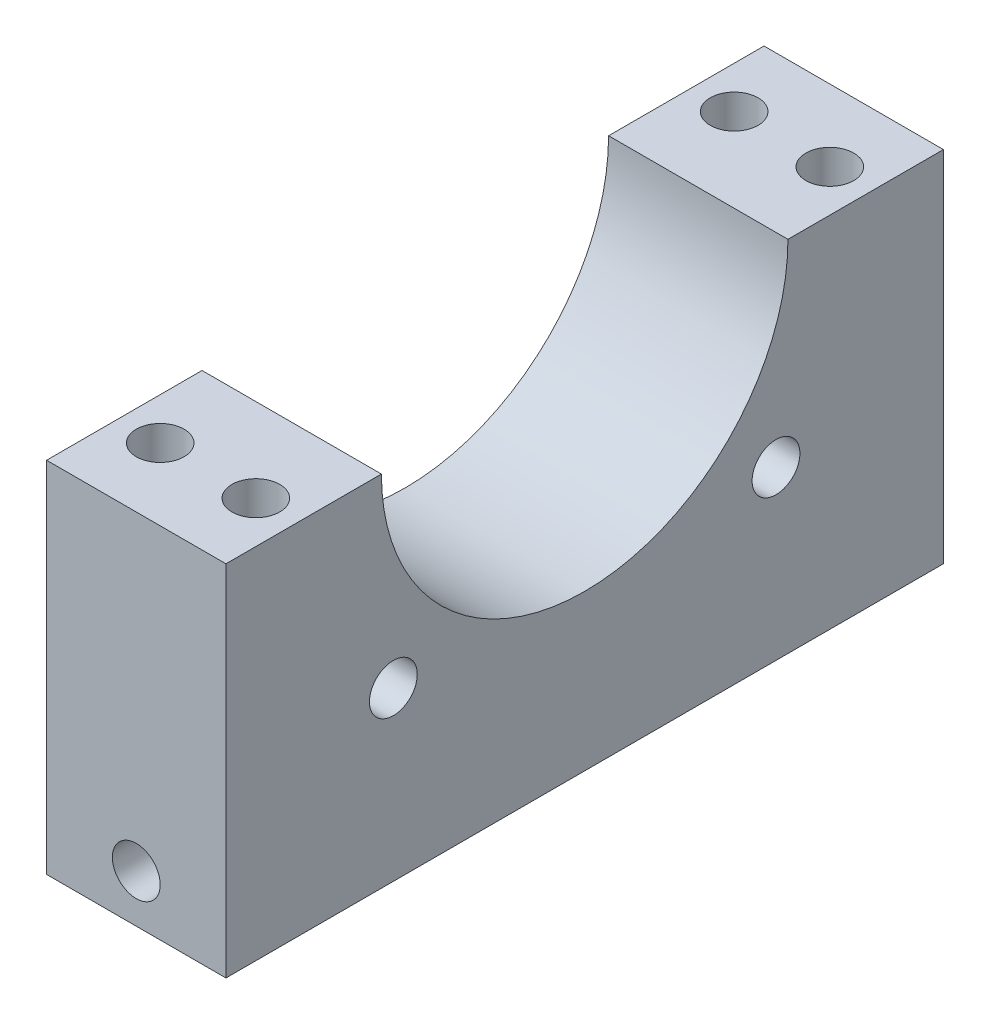
ISO-10303-21;
HEADER;
FILE_DESCRIPTION(('STEP AP214'),'2;1');
FILE_NAME('part.step','',(''),(''),'','','');
FILE_SCHEMA(('AUTOMOTIVE_DESIGN { 1 0 10303 214 1 1 1 1 }'));
ENDSEC;
DATA;
#1=APPLICATION_CONTEXT('core data for automotive mechanical design processes');
#2=APPLICATION_PROTOCOL_DEFINITION('international standard','automotive_design',2000,#1);
#3=PRODUCT_CONTEXT('',#1,'mechanical');
#4=PRODUCT('Part','Part','',(#3));
#5=PRODUCT_RELATED_PRODUCT_CATEGORY('part','',(#4));
#6=PRODUCT_DEFINITION_FORMATION('','',#4);
#7=PRODUCT_DEFINITION_CONTEXT('part definition',#1,'design');
#8=PRODUCT_DEFINITION('design','',#6,#7);
#9=PRODUCT_DEFINITION_SHAPE('','',#8);
#10=(LENGTH_UNIT() NAMED_UNIT(*) SI_UNIT(.MILLI.,.METRE.));
#11=(NAMED_UNIT(*) PLANE_ANGLE_UNIT() SI_UNIT($,.RADIAN.));
#12=(NAMED_UNIT(*) SI_UNIT($,.STERADIAN.) SOLID_ANGLE_UNIT());
#13=UNCERTAINTY_MEASURE_WITH_UNIT(LENGTH_MEASURE(1.E-05),#10,'distance_accuracy_value','');
#14=(GEOMETRIC_REPRESENTATION_CONTEXT(3) GLOBAL_UNCERTAINTY_ASSIGNED_CONTEXT((#13)) GLOBAL_UNIT_ASSIGNED_CONTEXT((#10,
#11,#12)) REPRESENTATION_CONTEXT('',''));
#15=CARTESIAN_POINT('',(0.,0.,0.));
#16=DIRECTION('',(0.,0.,1.));
#17=DIRECTION('',(1.,0.,0.));
#18=AXIS2_PLACEMENT_3D('',#15,#16,#17);
#19=CARTESIAN_POINT('',(-7.5,70.,30.));
#20=DIRECTION('',(1.,0.,0.));
#21=DIRECTION('',(0.,0.,-1.));
#22=AXIS2_PLACEMENT_3D('',#19,#20,#21);
#23=PLANE('',#22);
#24=DIRECTION('',(0.,-1.,0.));
#25=VECTOR('',#24,1.);
#26=CARTESIAN_POINT('',(-7.5,70.,30.));
#27=LINE('',#26,#25);
#28=CARTESIAN_POINT('',(-7.5,30.,30.));
#29=VERTEX_POINT('',#28);
#30=CARTESIAN_POINT('',(-7.5,0.,30.));
#31=VERTEX_POINT('',#30);
#32=EDGE_CURVE('E113',#29,#31,#27,.T.);
#33=ORIENTED_EDGE('',*,*,#32,.F.);
#34=DIRECTION('',(0.,0.,-1.));
#35=VECTOR('',#34,1.);
#36=CARTESIAN_POINT('',(-7.5,30.,30.));
#37=LINE('',#36,#35);
#38=CARTESIAN_POINT('',(-7.5,30.,17.));
#39=VERTEX_POINT('',#38);
#40=EDGE_CURVE('E91',#29,#39,#37,.T.);
#41=ORIENTED_EDGE('',*,*,#40,.T.);
#42=CARTESIAN_POINT('',(-7.5,30.,0.));
#43=DIRECTION('',(1.,0.,0.));
#44=DIRECTION('',(0.,0.,-1.));
#45=AXIS2_PLACEMENT_3D('',#42,#43,#44);
#46=CIRCLE('',#45,17.);
#47=CARTESIAN_POINT('',(-7.5,30.,-17.));
#48=VERTEX_POINT('',#47);
#49=EDGE_CURVE('E124',#39,#48,#46,.T.);
#50=ORIENTED_EDGE('',*,*,#49,.T.);
#51=CARTESIAN_POINT('',(-7.5,30.,-30.));
#52=VERTEX_POINT('',#51);
#53=EDGE_CURVE('E53',#48,#52,#37,.T.);
#54=ORIENTED_EDGE('',*,*,#53,.T.);
#55=DIRECTION('',(0.,-1.,0.));
#56=VECTOR('',#55,1.);
#57=CARTESIAN_POINT('',(-7.5,70.,-30.));
#58=LINE('',#57,#56);
#59=CARTESIAN_POINT('',(-7.5,0.,-30.));
#60=VERTEX_POINT('',#59);
#61=EDGE_CURVE('E117',#52,#60,#58,.T.);
#62=ORIENTED_EDGE('',*,*,#61,.T.);
#63=DIRECTION('',(0.,0.,1.));
#64=VECTOR('',#63,1.);
#65=CARTESIAN_POINT('',(-7.5,0.,30.));
#66=LINE('',#65,#64);
#67=EDGE_CURVE('E133',#60,#31,#66,.T.);
#68=ORIENTED_EDGE('',*,*,#67,.T.);
#69=EDGE_LOOP('',(#33,#41,#50,#54,#62,#68));
#70=FACE_BOUND('',#69,.T.);
#71=ADVANCED_FACE('F39',(#70),#23,.F.);
#72=CARTESIAN_POINT('',(7.5,70.,30.));
#73=DIRECTION('',(0.,0.,-1.));
#74=DIRECTION('',(-1.,0.,0.));
#75=AXIS2_PLACEMENT_3D('',#72,#73,#74);
#76=PLANE('',#75);
#77=CARTESIAN_POINT('',(4.44089209850063E-13,4.00000000003941,30.));
#78=DIRECTION('',(0.,0.,1.));
#79=DIRECTION('',(1.,0.,0.));
#80=AXIS2_PLACEMENT_3D('',#77,#78,#79);
#81=CIRCLE('',#80,2.);
#82=CARTESIAN_POINT('',(2.00000000000044,4.00000000003941,30.));
#83=VERTEX_POINT('',#82);
#84=EDGE_CURVE('E191',#83,#83,#81,.T.);
#85=ORIENTED_EDGE('',*,*,#84,.F.);
#86=EDGE_LOOP('',(#85));
#87=FACE_BOUND('',#86,.T.);
#88=DIRECTION('',(0.,-1.,0.));
#89=VECTOR('',#88,1.);
#90=CARTESIAN_POINT('',(7.5,70.,30.));
#91=LINE('',#90,#89);
#92=CARTESIAN_POINT('',(7.5,30.,30.));
#93=VERTEX_POINT('',#92);
#94=CARTESIAN_POINT('',(7.5,0.,30.));
#95=VERTEX_POINT('',#94);
#96=EDGE_CURVE('E102',#93,#95,#91,.T.);
#97=ORIENTED_EDGE('',*,*,#96,.F.);
#98=DIRECTION('',(1.,0.,0.));
#99=VECTOR('',#98,1.);
#100=CARTESIAN_POINT('',(-21.5,30.,30.));
#101=LINE('',#100,#99);
#102=EDGE_CURVE('E88',#29,#93,#101,.T.);
#103=ORIENTED_EDGE('',*,*,#102,.F.);
#104=ORIENTED_EDGE('',*,*,#32,.T.);
#105=DIRECTION('',(1.,0.,0.));
#106=VECTOR('',#105,1.);
#107=CARTESIAN_POINT('',(7.5,0.,30.));
#108=LINE('',#107,#106);
#109=EDGE_CURVE('E111',#31,#95,#108,.T.);
#110=ORIENTED_EDGE('',*,*,#109,.T.);
#111=EDGE_LOOP('',(#97,#103,#104,#110));
#112=FACE_BOUND('',#111,.T.);
#113=ADVANCED_FACE('F109',(#87,#112),#76,.F.);
#114=CARTESIAN_POINT('',(7.5,70.,30.));
#115=DIRECTION('',(-1.,0.,0.));
#116=DIRECTION('',(0.,0.,1.));
#117=AXIS2_PLACEMENT_3D('',#114,#115,#116);
#118=PLANE('',#117);
#119=CARTESIAN_POINT('',(7.5,14.,16.));
#120=DIRECTION('',(1.,0.,0.));
#121=DIRECTION('',(0.,0.,-1.));
#122=AXIS2_PLACEMENT_3D('',#119,#120,#121);
#123=CIRCLE('',#122,2.);
#124=CARTESIAN_POINT('',(7.5,14.,14.));
#125=VERTEX_POINT('',#124);
#126=EDGE_CURVE('E180',#125,#125,#123,.T.);
#127=ORIENTED_EDGE('',*,*,#126,.F.);
#128=EDGE_LOOP('',(#127));
#129=FACE_BOUND('',#128,.T.);
#130=CARTESIAN_POINT('',(7.5,14.,-16.));
#131=DIRECTION('',(1.,0.,0.));
#132=DIRECTION('',(0.,0.,-1.));
#133=AXIS2_PLACEMENT_3D('',#130,#131,#132);
#134=CIRCLE('',#133,2.);
#135=CARTESIAN_POINT('',(7.5,14.,-18.));
#136=VERTEX_POINT('',#135);
#137=EDGE_CURVE('E176',#136,#136,#134,.T.);
#138=ORIENTED_EDGE('',*,*,#137,.F.);
#139=EDGE_LOOP('',(#138));
#140=FACE_BOUND('',#139,.T.);
#141=DIRECTION('',(0.,-1.,0.));
#142=VECTOR('',#141,1.);
#143=CARTESIAN_POINT('',(7.5,70.,-30.));
#144=LINE('',#143,#142);
#145=CARTESIAN_POINT('',(7.5,30.,-30.));
#146=VERTEX_POINT('',#145);
#147=CARTESIAN_POINT('',(7.5,0.,-30.));
#148=VERTEX_POINT('',#147);
#149=EDGE_CURVE('E114',#146,#148,#144,.T.);
#150=ORIENTED_EDGE('',*,*,#149,.F.);
#151=DIRECTION('',(0.,0.,-1.));
#152=VECTOR('',#151,1.);
#153=CARTESIAN_POINT('',(7.5,30.,30.));
#154=LINE('',#153,#152);
#155=CARTESIAN_POINT('',(7.50000000000001,30.,-17.));
#156=VERTEX_POINT('',#155);
#157=EDGE_CURVE('E107',#156,#146,#154,.T.);
#158=ORIENTED_EDGE('',*,*,#157,.F.);
#159=CARTESIAN_POINT('',(7.5,30.,0.));
#160=DIRECTION('',(1.,0.,0.));
#161=DIRECTION('',(0.,0.,-1.));
#162=AXIS2_PLACEMENT_3D('',#159,#160,#161);
#163=CIRCLE('',#162,17.);
#164=CARTESIAN_POINT('',(7.5,30.,17.));
#165=VERTEX_POINT('',#164);
#166=EDGE_CURVE('E106',#165,#156,#163,.T.);
#167=ORIENTED_EDGE('',*,*,#166,.F.);
#168=EDGE_CURVE('E60',#93,#165,#154,.T.);
#169=ORIENTED_EDGE('',*,*,#168,.F.);
#170=ORIENTED_EDGE('',*,*,#96,.T.);
#171=DIRECTION('',(0.,0.,-1.));
#172=VECTOR('',#171,1.);
#173=CARTESIAN_POINT('',(7.5,0.,30.));
#174=LINE('',#173,#172);
#175=EDGE_CURVE('E136',#95,#148,#174,.T.);
#176=ORIENTED_EDGE('',*,*,#175,.T.);
#177=EDGE_LOOP('',(#150,#158,#167,#169,#170,#176));
#178=FACE_BOUND('',#177,.T.);
#179=ADVANCED_FACE('F100',(#129,#140,#178),#118,.F.);
#180=CARTESIAN_POINT('',(7.5,70.,-30.));
#181=DIRECTION('',(0.,0.,1.));
#182=DIRECTION('',(1.,0.,0.));
#183=AXIS2_PLACEMENT_3D('',#180,#181,#182);
#184=PLANE('',#183);
#185=CARTESIAN_POINT('',(4.44089209850063E-13,4.00000000003941,-30.));
#186=DIRECTION('',(0.,0.,-1.));
#187=DIRECTION('',(-1.,0.,0.));
#188=AXIS2_PLACEMENT_3D('',#185,#186,#187);
#189=CIRCLE('',#188,2.);
#190=CARTESIAN_POINT('',(-1.99999999999956,4.00000000003941,-30.));
#191=VERTEX_POINT('',#190);
#192=EDGE_CURVE('E185',#191,#191,#189,.T.);
#193=ORIENTED_EDGE('',*,*,#192,.F.);
#194=EDGE_LOOP('',(#193));
#195=FACE_BOUND('',#194,.T.);
#196=ORIENTED_EDGE('',*,*,#61,.F.);
#197=DIRECTION('',(1.,0.,0.));
#198=VECTOR('',#197,1.);
#199=CARTESIAN_POINT('',(-21.5,30.,-30.));
#200=LINE('',#199,#198);
#201=EDGE_CURVE('E95',#52,#146,#200,.T.);
#202=ORIENTED_EDGE('',*,*,#201,.T.);
#203=ORIENTED_EDGE('',*,*,#149,.T.);
#204=DIRECTION('',(-1.,0.,0.));
#205=VECTOR('',#204,1.);
#206=CARTESIAN_POINT('',(7.5,0.,-30.));
#207=LINE('',#206,#205);
#208=EDGE_CURVE('E138',#148,#60,#207,.T.);
#209=ORIENTED_EDGE('',*,*,#208,.T.);
#210=EDGE_LOOP('',(#196,#202,#203,#209));
#211=FACE_BOUND('',#210,.T.);
#212=ADVANCED_FACE('F144',(#195,#211),#184,.F.);
#213=CARTESIAN_POINT('',(0.,0.,0.));
#214=DIRECTION('',(0.,1.,0.));
#215=DIRECTION('',(0.,0.,1.));
#216=AXIS2_PLACEMENT_3D('',#213,#214,#215);
#217=PLANE('',#216);
#218=ORIENTED_EDGE('',*,*,#67,.F.);
#219=ORIENTED_EDGE('',*,*,#208,.F.);
#220=ORIENTED_EDGE('',*,*,#175,.F.);
#221=ORIENTED_EDGE('',*,*,#109,.F.);
#222=EDGE_LOOP('',(#218,#219,#220,#221));
#223=FACE_BOUND('',#222,.T.);
#224=ADVANCED_FACE('F146',(#223),#217,.F.);
#225=CARTESIAN_POINT('',(-62.5,30.,0.));
#226=DIRECTION('',(1.,0.,0.));
#227=DIRECTION('',(0.,0.,-1.));
#228=AXIS2_PLACEMENT_3D('',#225,#226,#227);
#229=CYLINDRICAL_SURFACE('',#228,17.);
#230=ORIENTED_EDGE('',*,*,#166,.T.);
#231=DIRECTION('',(1.,0.,0.));
#232=VECTOR('',#231,1.);
#233=CARTESIAN_POINT('',(-62.5,30.,-17.));
#234=LINE('',#233,#232);
#235=EDGE_CURVE('E11',#156,#48,#234,.F.);
#236=ORIENTED_EDGE('',*,*,#235,.T.);
#237=ORIENTED_EDGE('',*,*,#49,.F.);
#238=DIRECTION('',(1.,0.,0.));
#239=VECTOR('',#238,1.);
#240=CARTESIAN_POINT('',(-62.5,30.,17.));
#241=LINE('',#240,#239);
#242=EDGE_CURVE('E46',#39,#165,#241,.T.);
#243=ORIENTED_EDGE('',*,*,#242,.T.);
#244=EDGE_LOOP('',(#230,#236,#237,#243));
#245=FACE_BOUND('',#244,.T.);
#246=ADVANCED_FACE('F122',(#245),#229,.F.);
#247=CARTESIAN_POINT('',(-21.5,30.,30.));
#248=DIRECTION('',(0.,-1.,0.));
#249=DIRECTION('',(0.,0.,-1.));
#250=AXIS2_PLACEMENT_3D('',#247,#248,#249);
#251=PLANE('',#250);
#252=CARTESIAN_POINT('',(-4.,30.,24.));
#253=DIRECTION('',(0.,1.,0.));
#254=DIRECTION('',(0.,0.,1.));
#255=AXIS2_PLACEMENT_3D('',#252,#253,#254);
#256=CIRCLE('',#255,2.);
#257=CARTESIAN_POINT('',(-4.,30.,26.));
#258=VERTEX_POINT('',#257);
#259=EDGE_CURVE('E158',#258,#258,#256,.T.);
#260=ORIENTED_EDGE('',*,*,#259,.F.);
#261=EDGE_LOOP('',(#260));
#262=FACE_BOUND('',#261,.T.);
#263=CARTESIAN_POINT('',(4.00000000000001,30.,24.));
#264=DIRECTION('',(0.,1.,0.));
#265=DIRECTION('',(0.,0.,1.));
#266=AXIS2_PLACEMENT_3D('',#263,#264,#265);
#267=CIRCLE('',#266,2.);
#268=CARTESIAN_POINT('',(4.00000000000001,30.,26.));
#269=VERTEX_POINT('',#268);
#270=EDGE_CURVE('E159',#269,#269,#267,.T.);
#271=ORIENTED_EDGE('',*,*,#270,.F.);
#272=EDGE_LOOP('',(#271));
#273=FACE_BOUND('',#272,.T.);
#274=ORIENTED_EDGE('',*,*,#102,.T.);
#275=ORIENTED_EDGE('',*,*,#168,.T.);
#276=ORIENTED_EDGE('',*,*,#242,.F.);
#277=ORIENTED_EDGE('',*,*,#40,.F.);
#278=EDGE_LOOP('',(#274,#275,#276,#277));
#279=FACE_BOUND('',#278,.T.);
#280=ADVANCED_FACE('F89',(#262,#273,#279),#251,.F.);
#281=CARTESIAN_POINT('',(4.00000000000001,30.,-24.));
#282=DIRECTION('',(0.,1.,0.));
#283=DIRECTION('',(0.,0.,1.));
#284=AXIS2_PLACEMENT_3D('',#281,#282,#283);
#285=CIRCLE('',#284,2.);
#286=CARTESIAN_POINT('',(4.00000000000001,30.,-22.));
#287=VERTEX_POINT('',#286);
#288=EDGE_CURVE('E153',#287,#287,#285,.T.);
#289=ORIENTED_EDGE('',*,*,#288,.F.);
#290=EDGE_LOOP('',(#289));
#291=FACE_BOUND('',#290,.T.);
#292=CARTESIAN_POINT('',(-4.,30.,-24.));
#293=DIRECTION('',(0.,1.,0.));
#294=DIRECTION('',(0.,0.,1.));
#295=AXIS2_PLACEMENT_3D('',#292,#293,#294);
#296=CIRCLE('',#295,2.);
#297=CARTESIAN_POINT('',(-4.,30.,-22.));
#298=VERTEX_POINT('',#297);
#299=EDGE_CURVE('E149',#298,#298,#296,.T.);
#300=ORIENTED_EDGE('',*,*,#299,.F.);
#301=EDGE_LOOP('',(#300));
#302=FACE_BOUND('',#301,.T.);
#303=ORIENTED_EDGE('',*,*,#235,.F.);
#304=ORIENTED_EDGE('',*,*,#157,.T.);
#305=ORIENTED_EDGE('',*,*,#201,.F.);
#306=ORIENTED_EDGE('',*,*,#53,.F.);
#307=EDGE_LOOP('',(#303,#304,#305,#306));
#308=FACE_BOUND('',#307,.T.);
#309=ADVANCED_FACE('F222',(#291,#302,#308),#251,.F.);
#310=CARTESIAN_POINT('',(-4.,24.,-24.));
#311=DIRECTION('',(0.,1.,0.));
#312=DIRECTION('',(0.,0.,1.));
#313=AXIS2_PLACEMENT_3D('',#310,#311,#312);
#314=CYLINDRICAL_SURFACE('',#313,2.);
#315=CARTESIAN_POINT('',(-4.,24.,-24.));
#316=DIRECTION('',(0.,1.,0.));
#317=DIRECTION('',(0.,0.,1.));
#318=AXIS2_PLACEMENT_3D('',#315,#316,#317);
#319=CIRCLE('',#318,2.);
#320=CARTESIAN_POINT('',(-4.,24.,-22.));
#321=VERTEX_POINT('',#320);
#322=EDGE_CURVE('E147',#321,#321,#319,.T.);
#323=ORIENTED_EDGE('',*,*,#322,.F.);
#324=EDGE_LOOP('',(#323));
#325=FACE_BOUND('',#324,.T.);
#326=ORIENTED_EDGE('',*,*,#299,.T.);
#327=EDGE_LOOP('',(#326));
#328=FACE_BOUND('',#327,.T.);
#329=ADVANCED_FACE('F225',(#325,#328),#314,.F.);
#330=CARTESIAN_POINT('',(-4.,24.,-24.));
#331=DIRECTION('',(0.,1.,0.));
#332=DIRECTION('',(0.,0.,1.));
#333=AXIS2_PLACEMENT_3D('',#330,#331,#332);
#334=PLANE('',#333);
#335=ORIENTED_EDGE('',*,*,#322,.T.);
#336=EDGE_LOOP('',(#335));
#337=FACE_BOUND('',#336,.T.);
#338=ADVANCED_FACE('F229',(#337),#334,.T.);
#339=CARTESIAN_POINT('',(4.00000000000001,24.,-24.));
#340=DIRECTION('',(0.,1.,0.));
#341=DIRECTION('',(0.,0.,1.));
#342=AXIS2_PLACEMENT_3D('',#339,#340,#341);
#343=CYLINDRICAL_SURFACE('',#342,2.);
#344=CARTESIAN_POINT('',(4.00000000000001,24.,-24.));
#345=DIRECTION('',(0.,1.,0.));
#346=DIRECTION('',(0.,0.,1.));
#347=AXIS2_PLACEMENT_3D('',#344,#345,#346);
#348=CIRCLE('',#347,2.);
#349=CARTESIAN_POINT('',(4.00000000000001,24.,-22.));
#350=VERTEX_POINT('',#349);
#351=EDGE_CURVE('E162',#350,#350,#348,.T.);
#352=ORIENTED_EDGE('',*,*,#351,.F.);
#353=EDGE_LOOP('',(#352));
#354=FACE_BOUND('',#353,.T.);
#355=ORIENTED_EDGE('',*,*,#288,.T.);
#356=EDGE_LOOP('',(#355));
#357=FACE_BOUND('',#356,.T.);
#358=ADVANCED_FACE('F233',(#354,#357),#343,.F.);
#359=CARTESIAN_POINT('',(4.00000000000001,24.,-24.));
#360=DIRECTION('',(0.,1.,0.));
#361=DIRECTION('',(0.,0.,1.));
#362=AXIS2_PLACEMENT_3D('',#359,#360,#361);
#363=PLANE('',#362);
#364=ORIENTED_EDGE('',*,*,#351,.T.);
#365=EDGE_LOOP('',(#364));
#366=FACE_BOUND('',#365,.T.);
#367=ADVANCED_FACE('F245',(#366),#363,.T.);
#368=CARTESIAN_POINT('',(4.00000000000001,24.,24.));
#369=DIRECTION('',(0.,1.,0.));
#370=DIRECTION('',(0.,0.,1.));
#371=AXIS2_PLACEMENT_3D('',#368,#369,#370);
#372=CYLINDRICAL_SURFACE('',#371,2.);
#373=CARTESIAN_POINT('',(4.00000000000001,24.,24.));
#374=DIRECTION('',(0.,1.,0.));
#375=DIRECTION('',(0.,0.,1.));
#376=AXIS2_PLACEMENT_3D('',#373,#374,#375);
#377=CIRCLE('',#376,2.);
#378=CARTESIAN_POINT('',(4.00000000000001,24.,26.));
#379=VERTEX_POINT('',#378);
#380=EDGE_CURVE('E167',#379,#379,#377,.T.);
#381=ORIENTED_EDGE('',*,*,#380,.F.);
#382=EDGE_LOOP('',(#381));
#383=FACE_BOUND('',#382,.T.);
#384=ORIENTED_EDGE('',*,*,#270,.T.);
#385=EDGE_LOOP('',(#384));
#386=FACE_BOUND('',#385,.T.);
#387=ADVANCED_FACE('F248',(#383,#386),#372,.F.);
#388=CARTESIAN_POINT('',(4.00000000000001,24.,24.));
#389=DIRECTION('',(0.,1.,0.));
#390=DIRECTION('',(0.,0.,1.));
#391=AXIS2_PLACEMENT_3D('',#388,#389,#390);
#392=PLANE('',#391);
#393=ORIENTED_EDGE('',*,*,#380,.T.);
#394=EDGE_LOOP('',(#393));
#395=FACE_BOUND('',#394,.T.);
#396=ADVANCED_FACE('F243',(#395),#392,.T.);
#397=CARTESIAN_POINT('',(-4.,24.,24.));
#398=DIRECTION('',(0.,1.,0.));
#399=DIRECTION('',(0.,0.,1.));
#400=AXIS2_PLACEMENT_3D('',#397,#398,#399);
#401=CYLINDRICAL_SURFACE('',#400,2.);
#402=CARTESIAN_POINT('',(-4.,24.,24.));
#403=DIRECTION('',(0.,1.,0.));
#404=DIRECTION('',(0.,0.,1.));
#405=AXIS2_PLACEMENT_3D('',#402,#403,#404);
#406=CIRCLE('',#405,2.);
#407=CARTESIAN_POINT('',(-4.,24.,26.));
#408=VERTEX_POINT('',#407);
#409=EDGE_CURVE('E155',#408,#408,#406,.T.);
#410=ORIENTED_EDGE('',*,*,#409,.F.);
#411=EDGE_LOOP('',(#410));
#412=FACE_BOUND('',#411,.T.);
#413=ORIENTED_EDGE('',*,*,#259,.T.);
#414=EDGE_LOOP('',(#413));
#415=FACE_BOUND('',#414,.T.);
#416=ADVANCED_FACE('F239',(#412,#415),#401,.F.);
#417=CARTESIAN_POINT('',(-4.,24.,24.));
#418=DIRECTION('',(0.,1.,0.));
#419=DIRECTION('',(0.,0.,1.));
#420=AXIS2_PLACEMENT_3D('',#417,#418,#419);
#421=PLANE('',#420);
#422=ORIENTED_EDGE('',*,*,#409,.T.);
#423=EDGE_LOOP('',(#422));
#424=FACE_BOUND('',#423,.T.);
#425=ADVANCED_FACE('F235',(#424),#421,.T.);
#426=CARTESIAN_POINT('',(-2.5,14.,-16.));
#427=DIRECTION('',(1.,0.,0.));
#428=DIRECTION('',(0.,0.,-1.));
#429=AXIS2_PLACEMENT_3D('',#426,#427,#428);
#430=CYLINDRICAL_SURFACE('',#429,2.);
#431=CARTESIAN_POINT('',(-2.5,14.,-16.));
#432=DIRECTION('',(1.,0.,0.));
#433=DIRECTION('',(0.,0.,-1.));
#434=AXIS2_PLACEMENT_3D('',#431,#432,#433);
#435=CIRCLE('',#434,2.);
#436=CARTESIAN_POINT('',(-2.5,14.,-18.));
#437=VERTEX_POINT('',#436);
#438=EDGE_CURVE('E173',#437,#437,#435,.T.);
#439=ORIENTED_EDGE('',*,*,#438,.F.);
#440=EDGE_LOOP('',(#439));
#441=FACE_BOUND('',#440,.T.);
#442=ORIENTED_EDGE('',*,*,#137,.T.);
#443=EDGE_LOOP('',(#442));
#444=FACE_BOUND('',#443,.T.);
#445=ADVANCED_FACE('F238',(#441,#444),#430,.F.);
#446=CARTESIAN_POINT('',(-2.5,14.,-16.));
#447=DIRECTION('',(1.,0.,0.));
#448=DIRECTION('',(0.,0.,-1.));
#449=AXIS2_PLACEMENT_3D('',#446,#447,#448);
#450=PLANE('',#449);
#451=ORIENTED_EDGE('',*,*,#438,.T.);
#452=EDGE_LOOP('',(#451));
#453=FACE_BOUND('',#452,.T.);
#454=ADVANCED_FACE('F259',(#453),#450,.T.);
#455=CARTESIAN_POINT('',(-2.5,14.,16.));
#456=DIRECTION('',(1.,0.,0.));
#457=DIRECTION('',(0.,0.,-1.));
#458=AXIS2_PLACEMENT_3D('',#455,#456,#457);
#459=CYLINDRICAL_SURFACE('',#458,2.);
#460=CARTESIAN_POINT('',(-2.5,14.,16.));
#461=DIRECTION('',(1.,0.,0.));
#462=DIRECTION('',(0.,0.,-1.));
#463=AXIS2_PLACEMENT_3D('',#460,#461,#462);
#464=CIRCLE('',#463,2.);
#465=CARTESIAN_POINT('',(-2.5,14.,14.));
#466=VERTEX_POINT('',#465);
#467=EDGE_CURVE('E170',#466,#466,#464,.T.);
#468=ORIENTED_EDGE('',*,*,#467,.F.);
#469=EDGE_LOOP('',(#468));
#470=FACE_BOUND('',#469,.T.);
#471=ORIENTED_EDGE('',*,*,#126,.T.);
#472=EDGE_LOOP('',(#471));
#473=FACE_BOUND('',#472,.T.);
#474=ADVANCED_FACE('F262',(#470,#473),#459,.F.);
#475=CARTESIAN_POINT('',(-2.5,14.,16.));
#476=DIRECTION('',(1.,0.,0.));
#477=DIRECTION('',(0.,0.,-1.));
#478=AXIS2_PLACEMENT_3D('',#475,#476,#477);
#479=PLANE('',#478);
#480=ORIENTED_EDGE('',*,*,#467,.T.);
#481=EDGE_LOOP('',(#480));
#482=FACE_BOUND('',#481,.T.);
#483=ADVANCED_FACE('F269',(#482),#479,.T.);
#484=CARTESIAN_POINT('',(4.44089209850063E-13,4.00000000003941,-16.));
#485=DIRECTION('',(0.,0.,-1.));
#486=DIRECTION('',(-1.,0.,0.));
#487=AXIS2_PLACEMENT_3D('',#484,#485,#486);
#488=CYLINDRICAL_SURFACE('',#487,2.);
#489=CARTESIAN_POINT('',(4.44089209850063E-13,4.00000000003941,-16.));
#490=DIRECTION('',(0.,0.,-1.));
#491=DIRECTION('',(-1.,0.,0.));
#492=AXIS2_PLACEMENT_3D('',#489,#490,#491);
#493=CIRCLE('',#492,2.);
#494=CARTESIAN_POINT('',(-1.99999999999956,4.00000000003941,-16.));
#495=VERTEX_POINT('',#494);
#496=EDGE_CURVE('E177',#495,#495,#493,.T.);
#497=ORIENTED_EDGE('',*,*,#496,.F.);
#498=EDGE_LOOP('',(#497));
#499=FACE_BOUND('',#498,.T.);
#500=ORIENTED_EDGE('',*,*,#192,.T.);
#501=EDGE_LOOP('',(#500));
#502=FACE_BOUND('',#501,.T.);
#503=ADVANCED_FACE('F273',(#499,#502),#488,.F.);
#504=CARTESIAN_POINT('',(4.44089209850063E-13,4.00000000003941,-16.));
#505=DIRECTION('',(0.,0.,-1.));
#506=DIRECTION('',(-1.,0.,0.));
#507=AXIS2_PLACEMENT_3D('',#504,#505,#506);
#508=PLANE('',#507);
#509=ORIENTED_EDGE('',*,*,#496,.T.);
#510=EDGE_LOOP('',(#509));
#511=FACE_BOUND('',#510,.T.);
#512=ADVANCED_FACE('F202',(#511),#508,.T.);
#513=CARTESIAN_POINT('',(4.44089209850063E-13,4.00000000003941,16.));
#514=DIRECTION('',(0.,0.,1.));
#515=DIRECTION('',(1.,0.,0.));
#516=AXIS2_PLACEMENT_3D('',#513,#514,#515);
#517=CYLINDRICAL_SURFACE('',#516,2.);
#518=CARTESIAN_POINT('',(4.44089209850063E-13,4.00000000003941,16.));
#519=DIRECTION('',(0.,0.,1.));
#520=DIRECTION('',(1.,0.,0.));
#521=AXIS2_PLACEMENT_3D('',#518,#519,#520);
#522=CIRCLE('',#521,2.);
#523=CARTESIAN_POINT('',(2.00000000000044,4.00000000003941,16.));
#524=VERTEX_POINT('',#523);
#525=EDGE_CURVE('E188',#524,#524,#522,.T.);
#526=ORIENTED_EDGE('',*,*,#525,.F.);
#527=EDGE_LOOP('',(#526));
#528=FACE_BOUND('',#527,.T.);
#529=ORIENTED_EDGE('',*,*,#84,.T.);
#530=EDGE_LOOP('',(#529));
#531=FACE_BOUND('',#530,.T.);
#532=ADVANCED_FACE('F199',(#528,#531),#517,.F.);
#533=CARTESIAN_POINT('',(4.44089209850063E-13,4.00000000003941,16.));
#534=DIRECTION('',(0.,0.,1.));
#535=DIRECTION('',(1.,0.,0.));
#536=AXIS2_PLACEMENT_3D('',#533,#534,#535);
#537=PLANE('',#536);
#538=ORIENTED_EDGE('',*,*,#525,.T.);
#539=EDGE_LOOP('',(#538));
#540=FACE_BOUND('',#539,.T.);
#541=ADVANCED_FACE('F197',(#540),#537,.T.);
#542=CLOSED_SHELL('',(#71,#113,#179,#212,#224,#246,#280,#309,#329,#338,#358,#367,#387,#396,#416,
#425,#445,#454,#474,#483,#503,#512,#532,#541));
#543=MANIFOLD_SOLID_BREP('B2',#542);
#544=ADVANCED_BREP_SHAPE_REPRESENTATION('',(#18,#543),#14);
#545=SHAPE_DEFINITION_REPRESENTATION(#9,#544);
ENDSEC;
END-ISO-10303-21;
